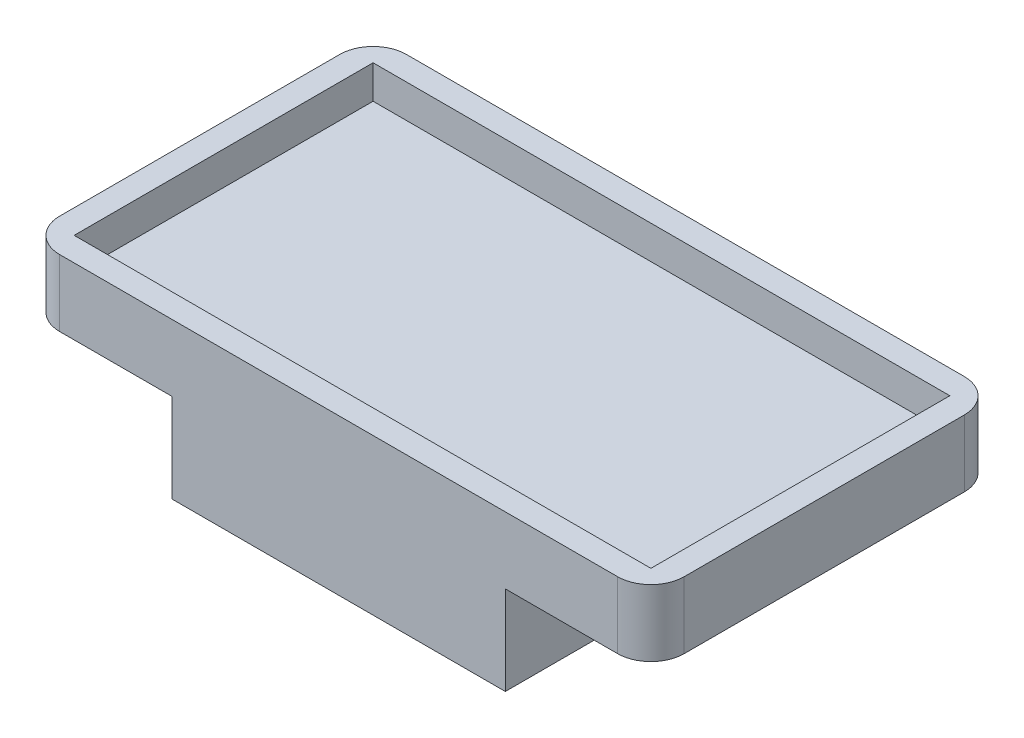
ISO-10303-21;
HEADER;
FILE_DESCRIPTION(('STEP AP214'),'2;1');
FILE_NAME('part.step','',(''),(''),'','','');
FILE_SCHEMA(('AUTOMOTIVE_DESIGN { 1 0 10303 214 1 1 1 1 }'));
ENDSEC;
DATA;
#1=APPLICATION_CONTEXT('core data for automotive mechanical design processes');
#2=APPLICATION_PROTOCOL_DEFINITION('international standard','automotive_design',2000,#1);
#3=PRODUCT_CONTEXT('',#1,'mechanical');
#4=PRODUCT('Part','Part','',(#3));
#5=PRODUCT_RELATED_PRODUCT_CATEGORY('part','',(#4));
#6=PRODUCT_DEFINITION_FORMATION('','',#4);
#7=PRODUCT_DEFINITION_CONTEXT('part definition',#1,'design');
#8=PRODUCT_DEFINITION('design','',#6,#7);
#9=PRODUCT_DEFINITION_SHAPE('','',#8);
#10=(LENGTH_UNIT() NAMED_UNIT(*) SI_UNIT(.MILLI.,.METRE.));
#11=(NAMED_UNIT(*) PLANE_ANGLE_UNIT() SI_UNIT($,.RADIAN.));
#12=(NAMED_UNIT(*) SI_UNIT($,.STERADIAN.) SOLID_ANGLE_UNIT());
#13=UNCERTAINTY_MEASURE_WITH_UNIT(LENGTH_MEASURE(1.E-05),#10,'distance_accuracy_value','');
#14=(GEOMETRIC_REPRESENTATION_CONTEXT(3) GLOBAL_UNCERTAINTY_ASSIGNED_CONTEXT((#13)) GLOBAL_UNIT_ASSIGNED_CONTEXT((#10,
#11,#12)) REPRESENTATION_CONTEXT('',''));
#15=CARTESIAN_POINT('',(0.,0.,0.));
#16=DIRECTION('',(0.,0.,1.));
#17=DIRECTION('',(1.,0.,0.));
#18=AXIS2_PLACEMENT_3D('',#15,#16,#17);
#19=CARTESIAN_POINT('',(0.,0.,0.));
#20=DIRECTION('',(0.,1.,0.));
#21=DIRECTION('',(0.,0.,1.));
#22=AXIS2_PLACEMENT_3D('',#19,#20,#21);
#23=PLANE('',#22);
#24=DIRECTION('',(1.,0.,0.));
#25=VECTOR('',#24,1.);
#26=CARTESIAN_POINT('',(-3.,0.,3.));
#27=LINE('',#26,#25);
#28=CARTESIAN_POINT('',(0.,0.,3.));
#29=VERTEX_POINT('',#28);
#30=CARTESIAN_POINT('',(10.1,0.,3.));
#31=VERTEX_POINT('',#30);
#32=EDGE_CURVE('E315',#29,#31,#27,.T.);
#33=ORIENTED_EDGE('',*,*,#32,.F.);
#34=CARTESIAN_POINT('',(0.,0.,0.));
#35=DIRECTION('',(0.,1.,0.));
#36=DIRECTION('',(0.,0.,1.));
#37=AXIS2_PLACEMENT_3D('',#34,#35,#36);
#38=CIRCLE('',#37,3.);
#39=CARTESIAN_POINT('',(-3.,0.,0.));
#40=VERTEX_POINT('',#39);
#41=EDGE_CURVE('E271',#29,#40,#38,.F.);
#42=ORIENTED_EDGE('',*,*,#41,.T.);
#43=DIRECTION('',(0.,0.,1.));
#44=VECTOR('',#43,1.);
#45=CARTESIAN_POINT('',(-3.,0.,-28.2));
#46=LINE('',#45,#44);
#47=CARTESIAN_POINT('',(-3.,0.,-25.2));
#48=VERTEX_POINT('',#47);
#49=EDGE_CURVE('E230',#48,#40,#46,.T.);
#50=ORIENTED_EDGE('',*,*,#49,.F.);
#51=CARTESIAN_POINT('',(0.,0.,-25.2));
#52=DIRECTION('',(0.,1.,0.));
#53=DIRECTION('',(0.,0.,1.));
#54=AXIS2_PLACEMENT_3D('',#51,#52,#53);
#55=CIRCLE('',#54,3.);
#56=CARTESIAN_POINT('',(0.,0.,-28.2));
#57=VERTEX_POINT('',#56);
#58=EDGE_CURVE('E269',#48,#57,#55,.F.);
#59=ORIENTED_EDGE('',*,*,#58,.T.);
#60=DIRECTION('',(-1.,0.,0.));
#61=VECTOR('',#60,1.);
#62=CARTESIAN_POINT('',(-3.,0.,-28.2));
#63=LINE('',#62,#61);
#64=CARTESIAN_POINT('',(50.2,0.,-28.2));
#65=VERTEX_POINT('',#64);
#66=EDGE_CURVE('E241',#65,#57,#63,.T.);
#67=ORIENTED_EDGE('',*,*,#66,.F.);
#68=CARTESIAN_POINT('',(50.2,0.,-25.2));
#69=DIRECTION('',(0.,1.,0.));
#70=DIRECTION('',(0.,0.,1.));
#71=AXIS2_PLACEMENT_3D('',#68,#69,#70);
#72=CIRCLE('',#71,3.);
#73=CARTESIAN_POINT('',(53.2,0.,-25.2));
#74=VERTEX_POINT('',#73);
#75=EDGE_CURVE('E265',#65,#74,#72,.F.);
#76=ORIENTED_EDGE('',*,*,#75,.T.);
#77=DIRECTION('',(0.,0.,-1.));
#78=VECTOR('',#77,1.);
#79=CARTESIAN_POINT('',(53.2,0.,-28.2));
#80=LINE('',#79,#78);
#81=CARTESIAN_POINT('',(53.2,0.,0.));
#82=VERTEX_POINT('',#81);
#83=EDGE_CURVE('E251',#82,#74,#80,.T.);
#84=ORIENTED_EDGE('',*,*,#83,.F.);
#85=CARTESIAN_POINT('',(50.2,0.,0.));
#86=DIRECTION('',(0.,1.,0.));
#87=DIRECTION('',(0.,0.,1.));
#88=AXIS2_PLACEMENT_3D('',#85,#86,#87);
#89=CIRCLE('',#88,3.);
#90=CARTESIAN_POINT('',(50.2,0.,3.));
#91=VERTEX_POINT('',#90);
#92=EDGE_CURVE('E267',#82,#91,#89,.F.);
#93=ORIENTED_EDGE('',*,*,#92,.T.);
#94=DIRECTION('',(1.,0.,0.));
#95=VECTOR('',#94,1.);
#96=CARTESIAN_POINT('',(53.2,0.,3.));
#97=LINE('',#96,#95);
#98=CARTESIAN_POINT('',(40.1,0.,3.));
#99=VERTEX_POINT('',#98);
#100=EDGE_CURVE('E182',#99,#91,#97,.T.);
#101=ORIENTED_EDGE('',*,*,#100,.F.);
#102=DIRECTION('',(0.,0.,-1.));
#103=VECTOR('',#102,1.);
#104=CARTESIAN_POINT('',(40.1,0.,3.));
#105=LINE('',#104,#103);
#106=CARTESIAN_POINT('',(40.1,0.,-1.7));
#107=VERTEX_POINT('',#106);
#108=EDGE_CURVE('E177',#99,#107,#105,.T.);
#109=ORIENTED_EDGE('',*,*,#108,.T.);
#110=DIRECTION('',(-1.,0.,0.));
#111=VECTOR('',#110,1.);
#112=CARTESIAN_POINT('',(53.2,0.,-1.7));
#113=LINE('',#112,#111);
#114=CARTESIAN_POINT('',(10.1,0.,-1.7));
#115=VERTEX_POINT('',#114);
#116=EDGE_CURVE('E203',#107,#115,#113,.T.);
#117=ORIENTED_EDGE('',*,*,#116,.T.);
#118=DIRECTION('',(0.,0.,-1.));
#119=VECTOR('',#118,1.);
#120=CARTESIAN_POINT('',(10.1,0.,3.));
#121=LINE('',#120,#119);
#122=EDGE_CURVE('E318',#31,#115,#121,.T.);
#123=ORIENTED_EDGE('',*,*,#122,.F.);
#124=EDGE_LOOP('',(#33,#42,#50,#59,#67,#76,#84,#93,#101,#109,#117,#123));
#125=FACE_BOUND('',#124,.T.);
#126=ADVANCED_FACE('F45',(#125),#23,.F.);
#127=CARTESIAN_POINT('',(-3.,6.,-28.2));
#128=DIRECTION('',(1.,0.,0.));
#129=DIRECTION('',(0.,0.,-1.));
#130=AXIS2_PLACEMENT_3D('',#127,#128,#129);
#131=PLANE('',#130);
#132=ORIENTED_EDGE('',*,*,#49,.T.);
#133=DIRECTION('',(0.,-1.,0.));
#134=VECTOR('',#133,1.);
#135=CARTESIAN_POINT('',(-3.,6.,0.));
#136=LINE('',#135,#134);
#137=CARTESIAN_POINT('',(-3.,6.,0.));
#138=VERTEX_POINT('',#137);
#139=EDGE_CURVE('E276',#40,#138,#136,.F.);
#140=ORIENTED_EDGE('',*,*,#139,.T.);
#141=DIRECTION('',(0.,0.,1.));
#142=VECTOR('',#141,1.);
#143=CARTESIAN_POINT('',(-3.,6.,-28.2));
#144=LINE('',#143,#142);
#145=CARTESIAN_POINT('',(-3.,6.,-25.2));
#146=VERTEX_POINT('',#145);
#147=EDGE_CURVE('E237',#146,#138,#144,.T.);
#148=ORIENTED_EDGE('',*,*,#147,.F.);
#149=DIRECTION('',(0.,-1.,0.));
#150=VECTOR('',#149,1.);
#151=CARTESIAN_POINT('',(-3.,6.,-25.2));
#152=LINE('',#151,#150);
#153=EDGE_CURVE('E273',#146,#48,#152,.T.);
#154=ORIENTED_EDGE('',*,*,#153,.T.);
#155=EDGE_LOOP('',(#132,#140,#148,#154));
#156=FACE_BOUND('',#155,.T.);
#157=ADVANCED_FACE('F309',(#156),#131,.F.);
#158=CARTESIAN_POINT('',(-3.,6.,3.));
#159=DIRECTION('',(0.,0.,-1.));
#160=DIRECTION('',(-1.,0.,0.));
#161=AXIS2_PLACEMENT_3D('',#158,#159,#160);
#162=PLANE('',#161);
#163=DIRECTION('',(1.,0.,0.));
#164=VECTOR('',#163,1.);
#165=CARTESIAN_POINT('',(-3.,6.,3.));
#166=LINE('',#165,#164);
#167=CARTESIAN_POINT('',(0.,6.,3.));
#168=VERTEX_POINT('',#167);
#169=CARTESIAN_POINT('',(50.2,6.,3.));
#170=VERTEX_POINT('',#169);
#171=EDGE_CURVE('E240',#168,#170,#166,.T.);
#172=ORIENTED_EDGE('',*,*,#171,.F.);
#173=DIRECTION('',(0.,-1.,0.));
#174=VECTOR('',#173,1.);
#175=CARTESIAN_POINT('',(0.,6.,3.));
#176=LINE('',#175,#174);
#177=EDGE_CURVE('E262',#168,#29,#176,.T.);
#178=ORIENTED_EDGE('',*,*,#177,.T.);
#179=ORIENTED_EDGE('',*,*,#32,.T.);
#180=DIRECTION('',(0.,-1.,0.));
#181=VECTOR('',#180,1.);
#182=CARTESIAN_POINT('',(10.1,-7.99999999999999,3.));
#183=LINE('',#182,#181);
#184=CARTESIAN_POINT('',(10.1,-7.99999999999999,3.));
#185=VERTEX_POINT('',#184);
#186=EDGE_CURVE('E198',#31,#185,#183,.T.);
#187=ORIENTED_EDGE('',*,*,#186,.T.);
#188=DIRECTION('',(-1.,0.,0.));
#189=VECTOR('',#188,1.);
#190=CARTESIAN_POINT('',(-3.,-8.,3.));
#191=LINE('',#190,#189);
#192=CARTESIAN_POINT('',(40.1,-8.,3.));
#193=VERTEX_POINT('',#192);
#194=EDGE_CURVE('E190',#193,#185,#191,.T.);
#195=ORIENTED_EDGE('',*,*,#194,.F.);
#196=DIRECTION('',(0.,1.,0.));
#197=VECTOR('',#196,1.);
#198=CARTESIAN_POINT('',(40.1,-8.,3.));
#199=LINE('',#198,#197);
#200=EDGE_CURVE('E171',#193,#99,#199,.T.);
#201=ORIENTED_EDGE('',*,*,#200,.T.);
#202=ORIENTED_EDGE('',*,*,#100,.T.);
#203=DIRECTION('',(0.,-1.,0.));
#204=VECTOR('',#203,1.);
#205=CARTESIAN_POINT('',(50.2,6.,3.));
#206=LINE('',#205,#204);
#207=EDGE_CURVE('E260',#91,#170,#206,.F.);
#208=ORIENTED_EDGE('',*,*,#207,.T.);
#209=EDGE_LOOP('',(#172,#178,#179,#187,#195,#201,#202,#208));
#210=FACE_BOUND('',#209,.T.);
#211=ADVANCED_FACE('F196',(#210),#162,.F.);
#212=CARTESIAN_POINT('',(53.2,6.,-28.2));
#213=DIRECTION('',(-1.,0.,0.));
#214=DIRECTION('',(0.,0.,1.));
#215=AXIS2_PLACEMENT_3D('',#212,#213,#214);
#216=PLANE('',#215);
#217=DIRECTION('',(0.,0.,-1.));
#218=VECTOR('',#217,1.);
#219=CARTESIAN_POINT('',(53.2,6.,-28.2));
#220=LINE('',#219,#218);
#221=CARTESIAN_POINT('',(53.2,6.,0.));
#222=VERTEX_POINT('',#221);
#223=CARTESIAN_POINT('',(53.2,6.,-25.2));
#224=VERTEX_POINT('',#223);
#225=EDGE_CURVE('E244',#222,#224,#220,.T.);
#226=ORIENTED_EDGE('',*,*,#225,.F.);
#227=DIRECTION('',(0.,-1.,0.));
#228=VECTOR('',#227,1.);
#229=CARTESIAN_POINT('',(53.2,6.,0.));
#230=LINE('',#229,#228);
#231=EDGE_CURVE('E11',#222,#82,#230,.T.);
#232=ORIENTED_EDGE('',*,*,#231,.T.);
#233=ORIENTED_EDGE('',*,*,#83,.T.);
#234=DIRECTION('',(0.,-1.,0.));
#235=VECTOR('',#234,1.);
#236=CARTESIAN_POINT('',(53.2,6.,-25.2));
#237=LINE('',#236,#235);
#238=EDGE_CURVE('E53',#74,#224,#237,.F.);
#239=ORIENTED_EDGE('',*,*,#238,.T.);
#240=EDGE_LOOP('',(#226,#232,#233,#239));
#241=FACE_BOUND('',#240,.T.);
#242=ADVANCED_FACE('F291',(#241),#216,.F.);
#243=CARTESIAN_POINT('',(-3.,6.,-28.2));
#244=DIRECTION('',(0.,0.,1.));
#245=DIRECTION('',(1.,0.,0.));
#246=AXIS2_PLACEMENT_3D('',#243,#244,#245);
#247=PLANE('',#246);
#248=ORIENTED_EDGE('',*,*,#66,.T.);
#249=DIRECTION('',(0.,-1.,0.));
#250=VECTOR('',#249,1.);
#251=CARTESIAN_POINT('',(0.,6.,-28.2));
#252=LINE('',#251,#250);
#253=CARTESIAN_POINT('',(0.,6.,-28.2));
#254=VERTEX_POINT('',#253);
#255=EDGE_CURVE('E60',#57,#254,#252,.F.);
#256=ORIENTED_EDGE('',*,*,#255,.T.);
#257=DIRECTION('',(-1.,0.,0.));
#258=VECTOR('',#257,1.);
#259=CARTESIAN_POINT('',(-3.,6.,-28.2));
#260=LINE('',#259,#258);
#261=CARTESIAN_POINT('',(50.2,6.,-28.2));
#262=VERTEX_POINT('',#261);
#263=EDGE_CURVE('E246',#262,#254,#260,.T.);
#264=ORIENTED_EDGE('',*,*,#263,.F.);
#265=DIRECTION('',(0.,-1.,0.));
#266=VECTOR('',#265,1.);
#267=CARTESIAN_POINT('',(50.2,6.,-28.2));
#268=LINE('',#267,#266);
#269=EDGE_CURVE('E285',#262,#65,#268,.T.);
#270=ORIENTED_EDGE('',*,*,#269,.T.);
#271=EDGE_LOOP('',(#248,#256,#264,#270));
#272=FACE_BOUND('',#271,.T.);
#273=ADVANCED_FACE('F299',(#272),#247,.F.);
#274=CARTESIAN_POINT('',(0.,6.,0.));
#275=DIRECTION('',(0.,1.,0.));
#276=DIRECTION('',(0.,0.,1.));
#277=AXIS2_PLACEMENT_3D('',#274,#275,#276);
#278=PLANE('',#277);
#279=DIRECTION('',(0.,0.,1.));
#280=VECTOR('',#279,1.);
#281=CARTESIAN_POINT('',(-0.849999999999997,6.,-26.05));
#282=LINE('',#281,#280);
#283=CARTESIAN_POINT('',(-0.849999999999997,6.,-26.05));
#284=VERTEX_POINT('',#283);
#285=CARTESIAN_POINT('',(-0.849999999999997,6.,0.85));
#286=VERTEX_POINT('',#285);
#287=EDGE_CURVE('E199',#284,#286,#282,.T.);
#288=ORIENTED_EDGE('',*,*,#287,.F.);
#289=DIRECTION('',(-1.,0.,0.));
#290=VECTOR('',#289,1.);
#291=CARTESIAN_POINT('',(-0.849999999999997,6.,-26.05));
#292=LINE('',#291,#290);
#293=CARTESIAN_POINT('',(51.05,6.,-26.05));
#294=VERTEX_POINT('',#293);
#295=EDGE_CURVE('E211',#294,#284,#292,.T.);
#296=ORIENTED_EDGE('',*,*,#295,.F.);
#297=DIRECTION('',(0.,0.,-1.));
#298=VECTOR('',#297,1.);
#299=CARTESIAN_POINT('',(51.05,6.,-26.05));
#300=LINE('',#299,#298);
#301=CARTESIAN_POINT('',(51.05,6.,0.85));
#302=VERTEX_POINT('',#301);
#303=EDGE_CURVE('E223',#302,#294,#300,.T.);
#304=ORIENTED_EDGE('',*,*,#303,.F.);
#305=DIRECTION('',(1.,0.,0.));
#306=VECTOR('',#305,1.);
#307=CARTESIAN_POINT('',(-0.849999999999997,6.,0.85));
#308=LINE('',#307,#306);
#309=EDGE_CURVE('E201',#286,#302,#308,.T.);
#310=ORIENTED_EDGE('',*,*,#309,.F.);
#311=EDGE_LOOP('',(#288,#296,#304,#310));
#312=FACE_BOUND('',#311,.T.);
#313=ORIENTED_EDGE('',*,*,#147,.T.);
#314=CARTESIAN_POINT('',(0.,6.,0.));
#315=DIRECTION('',(0.,1.,0.));
#316=DIRECTION('',(0.,0.,1.));
#317=AXIS2_PLACEMENT_3D('',#314,#315,#316);
#318=CIRCLE('',#317,3.);
#319=EDGE_CURVE('E283',#138,#168,#318,.T.);
#320=ORIENTED_EDGE('',*,*,#319,.T.);
#321=ORIENTED_EDGE('',*,*,#171,.T.);
#322=CARTESIAN_POINT('',(50.2,6.,0.));
#323=DIRECTION('',(0.,1.,0.));
#324=DIRECTION('',(0.,0.,1.));
#325=AXIS2_PLACEMENT_3D('',#322,#323,#324);
#326=CIRCLE('',#325,3.);
#327=EDGE_CURVE('E279',#170,#222,#326,.T.);
#328=ORIENTED_EDGE('',*,*,#327,.T.);
#329=ORIENTED_EDGE('',*,*,#225,.T.);
#330=CARTESIAN_POINT('',(50.2,6.,-25.2));
#331=DIRECTION('',(0.,1.,0.));
#332=DIRECTION('',(0.,0.,1.));
#333=AXIS2_PLACEMENT_3D('',#330,#331,#332);
#334=CIRCLE('',#333,3.);
#335=EDGE_CURVE('E67',#224,#262,#334,.T.);
#336=ORIENTED_EDGE('',*,*,#335,.T.);
#337=ORIENTED_EDGE('',*,*,#263,.T.);
#338=CARTESIAN_POINT('',(0.,6.,-25.2));
#339=DIRECTION('',(0.,1.,0.));
#340=DIRECTION('',(0.,0.,1.));
#341=AXIS2_PLACEMENT_3D('',#338,#339,#340);
#342=CIRCLE('',#341,3.);
#343=EDGE_CURVE('E281',#254,#146,#342,.T.);
#344=ORIENTED_EDGE('',*,*,#343,.T.);
#345=EDGE_LOOP('',(#313,#320,#321,#328,#329,#336,#337,#344));
#346=FACE_BOUND('',#345,.T.);
#347=ADVANCED_FACE('F295',(#312,#346),#278,.T.);
#348=CARTESIAN_POINT('',(-0.849999999999997,3.,-26.05));
#349=DIRECTION('',(-1.,0.,0.));
#350=DIRECTION('',(0.,0.,1.));
#351=AXIS2_PLACEMENT_3D('',#348,#349,#350);
#352=PLANE('',#351);
#353=ORIENTED_EDGE('',*,*,#287,.T.);
#354=DIRECTION('',(0.,1.,0.));
#355=VECTOR('',#354,1.);
#356=CARTESIAN_POINT('',(-0.849999999999997,3.,0.85));
#357=LINE('',#356,#355);
#358=CARTESIAN_POINT('',(-0.849999999999997,3.,0.85));
#359=VERTEX_POINT('',#358);
#360=EDGE_CURVE('E219',#359,#286,#357,.T.);
#361=ORIENTED_EDGE('',*,*,#360,.F.);
#362=DIRECTION('',(0.,0.,1.));
#363=VECTOR('',#362,1.);
#364=CARTESIAN_POINT('',(-0.849999999999997,3.,-26.05));
#365=LINE('',#364,#363);
#366=CARTESIAN_POINT('',(-0.849999999999997,3.,-26.05));
#367=VERTEX_POINT('',#366);
#368=EDGE_CURVE('E207',#367,#359,#365,.T.);
#369=ORIENTED_EDGE('',*,*,#368,.F.);
#370=DIRECTION('',(0.,1.,0.));
#371=VECTOR('',#370,1.);
#372=CARTESIAN_POINT('',(-0.849999999999997,3.,-26.05));
#373=LINE('',#372,#371);
#374=EDGE_CURVE('E228',#367,#284,#373,.T.);
#375=ORIENTED_EDGE('',*,*,#374,.T.);
#376=EDGE_LOOP('',(#353,#361,#369,#375));
#377=FACE_BOUND('',#376,.T.);
#378=ADVANCED_FACE('F404',(#377),#352,.F.);
#379=CARTESIAN_POINT('',(-0.849999999999997,3.,-26.05));
#380=DIRECTION('',(0.,0.,-1.));
#381=DIRECTION('',(-1.,0.,0.));
#382=AXIS2_PLACEMENT_3D('',#379,#380,#381);
#383=PLANE('',#382);
#384=ORIENTED_EDGE('',*,*,#295,.T.);
#385=ORIENTED_EDGE('',*,*,#374,.F.);
#386=DIRECTION('',(-1.,0.,0.));
#387=VECTOR('',#386,1.);
#388=CARTESIAN_POINT('',(-0.849999999999997,3.,-26.05));
#389=LINE('',#388,#387);
#390=CARTESIAN_POINT('',(51.05,3.,-26.05));
#391=VERTEX_POINT('',#390);
#392=EDGE_CURVE('E217',#391,#367,#389,.T.);
#393=ORIENTED_EDGE('',*,*,#392,.F.);
#394=DIRECTION('',(0.,1.,0.));
#395=VECTOR('',#394,1.);
#396=CARTESIAN_POINT('',(51.05,3.,-26.05));
#397=LINE('',#396,#395);
#398=EDGE_CURVE('E231',#391,#294,#397,.T.);
#399=ORIENTED_EDGE('',*,*,#398,.T.);
#400=EDGE_LOOP('',(#384,#385,#393,#399));
#401=FACE_BOUND('',#400,.T.);
#402=ADVANCED_FACE('F400',(#401),#383,.F.);
#403=CARTESIAN_POINT('',(51.05,3.,-26.05));
#404=DIRECTION('',(1.,0.,0.));
#405=DIRECTION('',(0.,0.,-1.));
#406=AXIS2_PLACEMENT_3D('',#403,#404,#405);
#407=PLANE('',#406);
#408=ORIENTED_EDGE('',*,*,#303,.T.);
#409=ORIENTED_EDGE('',*,*,#398,.F.);
#410=DIRECTION('',(0.,0.,-1.));
#411=VECTOR('',#410,1.);
#412=CARTESIAN_POINT('',(51.05,3.,-26.05));
#413=LINE('',#412,#411);
#414=CARTESIAN_POINT('',(51.05,3.,0.85));
#415=VERTEX_POINT('',#414);
#416=EDGE_CURVE('E214',#415,#391,#413,.T.);
#417=ORIENTED_EDGE('',*,*,#416,.F.);
#418=DIRECTION('',(0.,1.,0.));
#419=VECTOR('',#418,1.);
#420=CARTESIAN_POINT('',(51.05,3.,0.85));
#421=LINE('',#420,#419);
#422=EDGE_CURVE('E233',#415,#302,#421,.T.);
#423=ORIENTED_EDGE('',*,*,#422,.T.);
#424=EDGE_LOOP('',(#408,#409,#417,#423));
#425=FACE_BOUND('',#424,.T.);
#426=ADVANCED_FACE('F403',(#425),#407,.F.);
#427=CARTESIAN_POINT('',(-0.849999999999997,3.,0.85));
#428=DIRECTION('',(0.,0.,1.));
#429=DIRECTION('',(1.,0.,0.));
#430=AXIS2_PLACEMENT_3D('',#427,#428,#429);
#431=PLANE('',#430);
#432=ORIENTED_EDGE('',*,*,#309,.T.);
#433=ORIENTED_EDGE('',*,*,#422,.F.);
#434=DIRECTION('',(1.,0.,0.));
#435=VECTOR('',#434,1.);
#436=CARTESIAN_POINT('',(-0.849999999999997,3.,0.85));
#437=LINE('',#436,#435);
#438=EDGE_CURVE('E210',#359,#415,#437,.T.);
#439=ORIENTED_EDGE('',*,*,#438,.F.);
#440=ORIENTED_EDGE('',*,*,#360,.T.);
#441=EDGE_LOOP('',(#432,#433,#439,#440));
#442=FACE_BOUND('',#441,.T.);
#443=ADVANCED_FACE('F398',(#442),#431,.F.);
#444=CARTESIAN_POINT('',(0.,3.,0.));
#445=DIRECTION('',(0.,1.,0.));
#446=DIRECTION('',(0.,0.,1.));
#447=AXIS2_PLACEMENT_3D('',#444,#445,#446);
#448=PLANE('',#447);
#449=ORIENTED_EDGE('',*,*,#368,.T.);
#450=ORIENTED_EDGE('',*,*,#438,.T.);
#451=ORIENTED_EDGE('',*,*,#416,.T.);
#452=ORIENTED_EDGE('',*,*,#392,.T.);
#453=EDGE_LOOP('',(#449,#450,#451,#452));
#454=FACE_BOUND('',#453,.T.);
#455=ADVANCED_FACE('F395',(#454),#448,.T.);
#456=CARTESIAN_POINT('',(-2.99999999999999,-8.,-15.));
#457=DIRECTION('',(0.,0.,1.));
#458=DIRECTION('',(1.,0.,0.));
#459=AXIS2_PLACEMENT_3D('',#456,#457,#458);
#460=PLANE('',#459);
#461=DIRECTION('',(-1.,0.,0.));
#462=VECTOR('',#461,1.);
#463=CARTESIAN_POINT('',(53.2,-3.9,-15.));
#464=LINE('',#463,#462);
#465=CARTESIAN_POINT('',(40.1,-3.9,-15.));
#466=VERTEX_POINT('',#465);
#467=CARTESIAN_POINT('',(10.1,-3.9,-15.));
#468=VERTEX_POINT('',#467);
#469=EDGE_CURVE('E330',#466,#468,#464,.T.);
#470=ORIENTED_EDGE('',*,*,#469,.F.);
#471=DIRECTION('',(0.,1.,0.));
#472=VECTOR('',#471,1.);
#473=CARTESIAN_POINT('',(40.1,-8.,-15.));
#474=LINE('',#473,#472);
#475=CARTESIAN_POINT('',(40.1,-8.,-15.));
#476=VERTEX_POINT('',#475);
#477=EDGE_CURVE('E183',#476,#466,#474,.T.);
#478=ORIENTED_EDGE('',*,*,#477,.F.);
#479=DIRECTION('',(1.,0.,0.));
#480=VECTOR('',#479,1.);
#481=CARTESIAN_POINT('',(-2.99999999999999,-8.,-15.));
#482=LINE('',#481,#480);
#483=CARTESIAN_POINT('',(10.1,-7.99999999999999,-15.));
#484=VERTEX_POINT('',#483);
#485=EDGE_CURVE('E192',#484,#476,#482,.T.);
#486=ORIENTED_EDGE('',*,*,#485,.F.);
#487=DIRECTION('',(0.,-1.,0.));
#488=VECTOR('',#487,1.);
#489=CARTESIAN_POINT('',(10.1,-7.99999999999999,-15.));
#490=LINE('',#489,#488);
#491=EDGE_CURVE('E319',#468,#484,#490,.T.);
#492=ORIENTED_EDGE('',*,*,#491,.F.);
#493=EDGE_LOOP('',(#470,#478,#486,#492));
#494=FACE_BOUND('',#493,.T.);
#495=ADVANCED_FACE('F341',(#494),#460,.F.);
#496=CARTESIAN_POINT('',(0.,-8.,0.));
#497=DIRECTION('',(0.,-1.,0.));
#498=DIRECTION('',(0.,0.,-1.));
#499=AXIS2_PLACEMENT_3D('',#496,#497,#498);
#500=PLANE('',#499);
#501=DIRECTION('',(0.,0.,-1.));
#502=VECTOR('',#501,1.);
#503=CARTESIAN_POINT('',(40.1,-8.,3.));
#504=LINE('',#503,#502);
#505=EDGE_CURVE('E174',#193,#476,#504,.T.);
#506=ORIENTED_EDGE('',*,*,#505,.F.);
#507=ORIENTED_EDGE('',*,*,#194,.T.);
#508=DIRECTION('',(0.,0.,-1.));
#509=VECTOR('',#508,1.);
#510=CARTESIAN_POINT('',(10.1,-7.99999999999999,3.));
#511=LINE('',#510,#509);
#512=EDGE_CURVE('E344',#185,#484,#511,.T.);
#513=ORIENTED_EDGE('',*,*,#512,.T.);
#514=ORIENTED_EDGE('',*,*,#485,.T.);
#515=EDGE_LOOP('',(#506,#507,#513,#514));
#516=FACE_BOUND('',#515,.T.);
#517=ADVANCED_FACE('F188',(#516),#500,.T.);
#518=CARTESIAN_POINT('',(53.2,0.,-1.7));
#519=DIRECTION('',(0.,0.,1.));
#520=DIRECTION('',(1.,0.,0.));
#521=AXIS2_PLACEMENT_3D('',#518,#519,#520);
#522=PLANE('',#521);
#523=ORIENTED_EDGE('',*,*,#116,.F.);
#524=DIRECTION('',(0.,-1.,0.));
#525=VECTOR('',#524,1.);
#526=CARTESIAN_POINT('',(40.1,0.,-1.7));
#527=LINE('',#526,#525);
#528=CARTESIAN_POINT('',(40.1,-3.9,-1.7));
#529=VERTEX_POINT('',#528);
#530=EDGE_CURVE('E327',#107,#529,#527,.T.);
#531=ORIENTED_EDGE('',*,*,#530,.T.);
#532=DIRECTION('',(-1.,0.,0.));
#533=VECTOR('',#532,1.);
#534=CARTESIAN_POINT('',(53.2,-3.9,-1.7));
#535=LINE('',#534,#533);
#536=CARTESIAN_POINT('',(10.1,-3.9,-1.7));
#537=VERTEX_POINT('',#536);
#538=EDGE_CURVE('E332',#529,#537,#535,.T.);
#539=ORIENTED_EDGE('',*,*,#538,.T.);
#540=DIRECTION('',(0.,1.,0.));
#541=VECTOR('',#540,1.);
#542=CARTESIAN_POINT('',(10.1,0.,-1.7));
#543=LINE('',#542,#541);
#544=EDGE_CURVE('E324',#537,#115,#543,.T.);
#545=ORIENTED_EDGE('',*,*,#544,.T.);
#546=EDGE_LOOP('',(#523,#531,#539,#545));
#547=FACE_BOUND('',#546,.T.);
#548=ADVANCED_FACE('F385',(#547),#522,.F.);
#549=CARTESIAN_POINT('',(53.2,-3.9,-15.));
#550=DIRECTION('',(0.,-1.,0.));
#551=DIRECTION('',(0.,0.,-1.));
#552=AXIS2_PLACEMENT_3D('',#549,#550,#551);
#553=PLANE('',#552);
#554=ORIENTED_EDGE('',*,*,#538,.F.);
#555=DIRECTION('',(0.,0.,-1.));
#556=VECTOR('',#555,1.);
#557=CARTESIAN_POINT('',(40.1,-3.9,-15.));
#558=LINE('',#557,#556);
#559=EDGE_CURVE('E257',#529,#466,#558,.T.);
#560=ORIENTED_EDGE('',*,*,#559,.T.);
#561=ORIENTED_EDGE('',*,*,#469,.T.);
#562=DIRECTION('',(0.,0.,1.));
#563=VECTOR('',#562,1.);
#564=CARTESIAN_POINT('',(10.1,-3.9,-15.));
#565=LINE('',#564,#563);
#566=EDGE_CURVE('E248',#468,#537,#565,.T.);
#567=ORIENTED_EDGE('',*,*,#566,.T.);
#568=EDGE_LOOP('',(#554,#560,#561,#567));
#569=FACE_BOUND('',#568,.T.);
#570=ADVANCED_FACE('F338',(#569),#553,.F.);
#571=CARTESIAN_POINT('',(10.1,-7.99999999999999,3.));
#572=DIRECTION('',(1.,0.,0.));
#573=DIRECTION('',(0.,1.,0.));
#574=AXIS2_PLACEMENT_3D('',#571,#572,#573);
#575=PLANE('',#574);
#576=ORIENTED_EDGE('',*,*,#566,.F.);
#577=ORIENTED_EDGE('',*,*,#491,.T.);
#578=ORIENTED_EDGE('',*,*,#512,.F.);
#579=ORIENTED_EDGE('',*,*,#186,.F.);
#580=ORIENTED_EDGE('',*,*,#122,.T.);
#581=ORIENTED_EDGE('',*,*,#544,.F.);
#582=EDGE_LOOP('',(#576,#577,#578,#579,#580,#581));
#583=FACE_BOUND('',#582,.T.);
#584=ADVANCED_FACE('F343',(#583),#575,.F.);
#585=CARTESIAN_POINT('',(40.1,-8.,3.));
#586=DIRECTION('',(-1.,0.,0.));
#587=DIRECTION('',(0.,0.,1.));
#588=AXIS2_PLACEMENT_3D('',#585,#586,#587);
#589=PLANE('',#588);
#590=ORIENTED_EDGE('',*,*,#108,.F.);
#591=ORIENTED_EDGE('',*,*,#200,.F.);
#592=ORIENTED_EDGE('',*,*,#505,.T.);
#593=ORIENTED_EDGE('',*,*,#477,.T.);
#594=ORIENTED_EDGE('',*,*,#559,.F.);
#595=ORIENTED_EDGE('',*,*,#530,.F.);
#596=EDGE_LOOP('',(#590,#591,#592,#593,#594,#595));
#597=FACE_BOUND('',#596,.T.);
#598=ADVANCED_FACE('F173',(#597),#589,.F.);
#599=CARTESIAN_POINT('',(0.,6.,0.));
#600=DIRECTION('',(0.,-1.,0.));
#601=DIRECTION('',(0.,0.,-1.));
#602=AXIS2_PLACEMENT_3D('',#599,#600,#601);
#603=CYLINDRICAL_SURFACE('',#602,3.);
#604=ORIENTED_EDGE('',*,*,#319,.F.);
#605=ORIENTED_EDGE('',*,*,#139,.F.);
#606=ORIENTED_EDGE('',*,*,#41,.F.);
#607=ORIENTED_EDGE('',*,*,#177,.F.);
#608=EDGE_LOOP('',(#604,#605,#606,#607));
#609=FACE_BOUND('',#608,.T.);
#610=ADVANCED_FACE('F314',(#609),#603,.T.);
#611=CARTESIAN_POINT('',(0.,6.,-25.2));
#612=DIRECTION('',(0.,-1.,0.));
#613=DIRECTION('',(0.,0.,-1.));
#614=AXIS2_PLACEMENT_3D('',#611,#612,#613);
#615=CYLINDRICAL_SURFACE('',#614,3.);
#616=ORIENTED_EDGE('',*,*,#343,.F.);
#617=ORIENTED_EDGE('',*,*,#255,.F.);
#618=ORIENTED_EDGE('',*,*,#58,.F.);
#619=ORIENTED_EDGE('',*,*,#153,.F.);
#620=EDGE_LOOP('',(#616,#617,#618,#619));
#621=FACE_BOUND('',#620,.T.);
#622=ADVANCED_FACE('F306',(#621),#615,.T.);
#623=CARTESIAN_POINT('',(50.2,6.,0.));
#624=DIRECTION('',(0.,-1.,0.));
#625=DIRECTION('',(0.,0.,-1.));
#626=AXIS2_PLACEMENT_3D('',#623,#624,#625);
#627=CYLINDRICAL_SURFACE('',#626,3.);
#628=ORIENTED_EDGE('',*,*,#327,.F.);
#629=ORIENTED_EDGE('',*,*,#207,.F.);
#630=ORIENTED_EDGE('',*,*,#92,.F.);
#631=ORIENTED_EDGE('',*,*,#231,.F.);
#632=EDGE_LOOP('',(#628,#629,#630,#631));
#633=FACE_BOUND('',#632,.T.);
#634=ADVANCED_FACE('F352',(#633),#627,.T.);
#635=CARTESIAN_POINT('',(50.2,6.,-25.2));
#636=DIRECTION('',(0.,-1.,0.));
#637=DIRECTION('',(0.,0.,-1.));
#638=AXIS2_PLACEMENT_3D('',#635,#636,#637);
#639=CYLINDRICAL_SURFACE('',#638,3.);
#640=ORIENTED_EDGE('',*,*,#335,.F.);
#641=ORIENTED_EDGE('',*,*,#238,.F.);
#642=ORIENTED_EDGE('',*,*,#75,.F.);
#643=ORIENTED_EDGE('',*,*,#269,.F.);
#644=EDGE_LOOP('',(#640,#641,#642,#643));
#645=FACE_BOUND('',#644,.T.);
#646=ADVANCED_FACE('F47',(#645),#639,.T.);
#647=CLOSED_SHELL('',(#126,#157,#211,#242,#273,#347,#378,#402,#426,#443,#455,#495,#517,#548,
#570,#584,#598,#610,#622,#634,#646));
#648=MANIFOLD_SOLID_BREP('B2',#647);
#649=ADVANCED_BREP_SHAPE_REPRESENTATION('',(#18,#648),#14);
#650=SHAPE_DEFINITION_REPRESENTATION(#9,#649);
ENDSEC;
END-ISO-10303-21;
